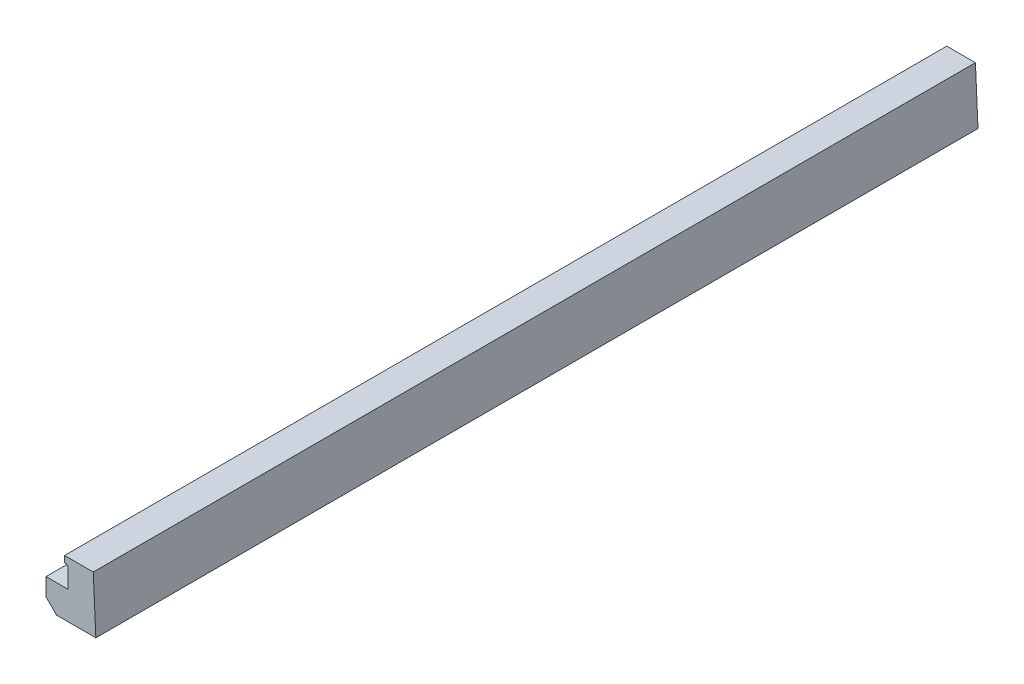
ISO-10303-21;
HEADER;
FILE_DESCRIPTION(('STEP AP214'),'2;1');
FILE_NAME('part.step','',(''),(''),'','','');
FILE_SCHEMA(('AUTOMOTIVE_DESIGN { 1 0 10303 214 1 1 1 1 }'));
ENDSEC;
DATA;
#1=APPLICATION_CONTEXT('core data for automotive mechanical design processes');
#2=APPLICATION_PROTOCOL_DEFINITION('international standard','automotive_design',2000,#1);
#3=PRODUCT_CONTEXT('',#1,'mechanical');
#4=PRODUCT('Part','Part','',(#3));
#5=PRODUCT_RELATED_PRODUCT_CATEGORY('part','',(#4));
#6=PRODUCT_DEFINITION_FORMATION('','',#4);
#7=PRODUCT_DEFINITION_CONTEXT('part definition',#1,'design');
#8=PRODUCT_DEFINITION('design','',#6,#7);
#9=PRODUCT_DEFINITION_SHAPE('','',#8);
#10=(LENGTH_UNIT() NAMED_UNIT(*) SI_UNIT(.MILLI.,.METRE.));
#11=(NAMED_UNIT(*) PLANE_ANGLE_UNIT() SI_UNIT($,.RADIAN.));
#12=(NAMED_UNIT(*) SI_UNIT($,.STERADIAN.) SOLID_ANGLE_UNIT());
#13=UNCERTAINTY_MEASURE_WITH_UNIT(LENGTH_MEASURE(1.E-05),#10,'distance_accuracy_value','');
#14=(GEOMETRIC_REPRESENTATION_CONTEXT(3) GLOBAL_UNCERTAINTY_ASSIGNED_CONTEXT((#13)) GLOBAL_UNIT_ASSIGNED_CONTEXT((#10,
#11,#12)) REPRESENTATION_CONTEXT('',''));
#15=CARTESIAN_POINT('',(0.,0.,0.));
#16=DIRECTION('',(0.,0.,1.));
#17=DIRECTION('',(1.,0.,0.));
#18=AXIS2_PLACEMENT_3D('',#15,#16,#17);
#19=CARTESIAN_POINT('',(19.49999999916,-19.50000000004,-47.));
#20=DIRECTION('',(0.,0.,-1.));
#21=DIRECTION('',(-1.,0.,0.));
#22=AXIS2_PLACEMENT_3D('',#19,#20,#21);
#23=PLANE('',#22);
#24=DIRECTION('',(0.0460603900408455,-0.998938657010171,0.));
#25=VECTOR('',#24,1.);
#26=CARTESIAN_POINT('',(0.845499997899992,22.60000000118,-47.));
#27=LINE('',#26,#25);
#28=CARTESIAN_POINT('',(0.845499997899992,22.60000000118,-47.));
#29=VERTEX_POINT('',#28);
#30=CARTESIAN_POINT('',(1.43224119488036,9.875,-47.));
#31=VERTEX_POINT('',#30);
#32=EDGE_CURVE('E292',#29,#31,#27,.T.);
#33=ORIENTED_EDGE('',*,*,#32,.T.);
#34=DIRECTION('',(1.,0.,0.));
#35=VECTOR('',#34,1.);
#36=CARTESIAN_POINT('',(-9.875,9.875,-47.));
#37=LINE('',#36,#35);
#38=CARTESIAN_POINT('',(-7.54154762208439,9.875,-47.));
#39=VERTEX_POINT('',#38);
#40=EDGE_CURVE('E248',#39,#31,#37,.T.);
#41=ORIENTED_EDGE('',*,*,#40,.F.);
#42=DIRECTION('',(0.707106781186548,-0.707106781186548,0.));
#43=VECTOR('',#42,1.);
#44=CARTESIAN_POINT('',(-9.95000000103665,12.2834523789523,-47.));
#45=LINE('',#44,#43);
#46=CARTESIAN_POINT('',(-9.95000000103665,12.2834523789523,-47.));
#47=VERTEX_POINT('',#46);
#48=EDGE_CURVE('E300',#47,#39,#45,.T.);
#49=ORIENTED_EDGE('',*,*,#48,.F.);
#50=DIRECTION('',(0.,1.,0.));
#51=VECTOR('',#50,1.);
#52=CARTESIAN_POINT('',(-9.94999999726113,16.5250000040714,-47.));
#53=LINE('',#52,#51);
#54=CARTESIAN_POINT('',(-9.94999999726113,16.30000000118,-47.));
#55=VERTEX_POINT('',#54);
#56=EDGE_CURVE('E308',#47,#55,#53,.T.);
#57=ORIENTED_EDGE('',*,*,#56,.T.);
#58=DIRECTION('',(-1.,0.,0.));
#59=VECTOR('',#58,1.);
#60=CARTESIAN_POINT('',(-4.89999999720113,16.30000000118,-47.));
#61=LINE('',#60,#59);
#62=CARTESIAN_POINT('',(-4.89999999720113,16.30000000118,-47.));
#63=VERTEX_POINT('',#62);
#64=EDGE_CURVE('E180',#63,#55,#61,.T.);
#65=ORIENTED_EDGE('',*,*,#64,.F.);
#66=DIRECTION('',(0.,1.,0.));
#67=VECTOR('',#66,1.);
#68=CARTESIAN_POINT('',(-4.89999999720113,20.5000000035114,-47.));
#69=LINE('',#68,#67);
#70=CARTESIAN_POINT('',(-4.89999999720113,20.5000000035114,-47.));
#71=VERTEX_POINT('',#70);
#72=EDGE_CURVE('E312',#63,#71,#69,.T.);
#73=ORIENTED_EDGE('',*,*,#72,.T.);
#74=CARTESIAN_POINT('',(-5.49999999720113,20.5000000035114,-47.));
#75=DIRECTION('',(0.,0.,1.));
#76=DIRECTION('',(1.,0.,0.));
#77=AXIS2_PLACEMENT_3D('',#74,#75,#76);
#78=CIRCLE('',#77,0.599999999999997);
#79=CARTESIAN_POINT('',(-5.49999999720113,21.1000000035114,-47.));
#80=VERTEX_POINT('',#79);
#81=EDGE_CURVE('E315',#71,#80,#78,.T.);
#82=ORIENTED_EDGE('',*,*,#81,.T.);
#83=CARTESIAN_POINT('',(-5.50000000210001,21.3000000035114,-47.));
#84=DIRECTION('',(0.,0.,-1.));
#85=DIRECTION('',(-1.,0.,0.));
#86=AXIS2_PLACEMENT_3D('',#83,#84,#85);
#87=CIRCLE('',#86,0.2);
#88=CARTESIAN_POINT('',(-5.70000000210001,21.3000000035114,-47.));
#89=VERTEX_POINT('',#88);
#90=EDGE_CURVE('E173',#80,#89,#87,.T.);
#91=ORIENTED_EDGE('',*,*,#90,.T.);
#92=DIRECTION('',(0.,1.,0.));
#93=VECTOR('',#92,1.);
#94=CARTESIAN_POINT('',(-5.70000000210001,22.00000000118,-47.));
#95=LINE('',#94,#93);
#96=CARTESIAN_POINT('',(-5.70000000210001,22.60000000118,-47.));
#97=VERTEX_POINT('',#96);
#98=EDGE_CURVE('E317',#89,#97,#95,.T.);
#99=ORIENTED_EDGE('',*,*,#98,.T.);
#100=DIRECTION('',(1.,0.,0.));
#101=VECTOR('',#100,1.);
#102=CARTESIAN_POINT('',(-5.70000000210001,22.60000000118,-47.));
#103=LINE('',#102,#101);
#104=EDGE_CURVE('E289',#97,#29,#103,.T.);
#105=ORIENTED_EDGE('',*,*,#104,.T.);
#106=EDGE_LOOP('',(#33,#41,#49,#57,#65,#73,#82,#91,#99,#105));
#107=FACE_BOUND('',#106,.T.);
#108=ADVANCED_FACE('F165',(#107),#23,.T.);
#109=CARTESIAN_POINT('',(-9.94999999726113,16.5250000040714,-47.));
#110=DIRECTION('',(1.,0.,0.));
#111=DIRECTION('',(0.,1.,0.));
#112=AXIS2_PLACEMENT_3D('',#109,#110,#111);
#113=PLANE('',#112);
#114=DIRECTION('',(0.,0.,1.));
#115=VECTOR('',#114,1.);
#116=CARTESIAN_POINT('',(-9.95000000103665,12.2834523789523,-47.));
#117=LINE('',#116,#115);
#118=CARTESIAN_POINT('',(-9.95000000103665,12.2834523789523,154.45));
#119=VERTEX_POINT('',#118);
#120=EDGE_CURVE('E298',#47,#119,#117,.T.);
#121=ORIENTED_EDGE('',*,*,#120,.T.);
#122=DIRECTION('',(-9.39991733488001E-10,-1.,0.));
#123=VECTOR('',#122,1.);
#124=CARTESIAN_POINT('',(-9.94999999726113,16.30000000118,154.45));
#125=LINE('',#124,#123);
#126=CARTESIAN_POINT('',(-9.94999999726113,16.30000000118,154.45));
#127=VERTEX_POINT('',#126);
#128=EDGE_CURVE('E286',#127,#119,#125,.T.);
#129=ORIENTED_EDGE('',*,*,#128,.F.);
#130=DIRECTION('',(0.,0.,1.));
#131=VECTOR('',#130,1.);
#132=CARTESIAN_POINT('',(-9.94999999726113,16.30000000118,-47.));
#133=LINE('',#132,#131);
#134=EDGE_CURVE('E305',#55,#127,#133,.T.);
#135=ORIENTED_EDGE('',*,*,#134,.F.);
#136=ORIENTED_EDGE('',*,*,#56,.F.);
#137=EDGE_LOOP('',(#121,#129,#135,#136));
#138=FACE_BOUND('',#137,.T.);
#139=ADVANCED_FACE('F335',(#138),#113,.F.);
#140=CARTESIAN_POINT('',(-5.70000000210001,22.00000000118,-47.));
#141=DIRECTION('',(1.,0.,0.));
#142=DIRECTION('',(0.,0.,-1.));
#143=AXIS2_PLACEMENT_3D('',#140,#141,#142);
#144=PLANE('',#143);
#145=ORIENTED_EDGE('',*,*,#98,.F.);
#146=DIRECTION('',(0.,0.,1.));
#147=VECTOR('',#146,1.);
#148=CARTESIAN_POINT('',(-5.70000000210001,21.3000000035114,-47.));
#149=LINE('',#148,#147);
#150=CARTESIAN_POINT('',(-5.70000000210001,21.3000000035114,154.45));
#151=VERTEX_POINT('',#150);
#152=EDGE_CURVE('E12',#89,#151,#149,.T.);
#153=ORIENTED_EDGE('',*,*,#152,.T.);
#154=DIRECTION('',(0.,-1.,0.));
#155=VECTOR('',#154,1.);
#156=CARTESIAN_POINT('',(-5.70000000210001,22.60000000118,154.45));
#157=LINE('',#156,#155);
#158=CARTESIAN_POINT('',(-5.70000000210001,22.60000000118,154.45));
#159=VERTEX_POINT('',#158);
#160=EDGE_CURVE('E271',#159,#151,#157,.T.);
#161=ORIENTED_EDGE('',*,*,#160,.F.);
#162=DIRECTION('',(0.,0.,1.));
#163=VECTOR('',#162,1.);
#164=CARTESIAN_POINT('',(-5.70000000210001,22.60000000118,-47.));
#165=LINE('',#164,#163);
#166=EDGE_CURVE('E293',#97,#159,#165,.T.);
#167=ORIENTED_EDGE('',*,*,#166,.F.);
#168=EDGE_LOOP('',(#145,#153,#161,#167));
#169=FACE_BOUND('',#168,.T.);
#170=ADVANCED_FACE('F345',(#169),#144,.F.);
#171=CARTESIAN_POINT('',(-5.49999999720113,20.5000000035114,-47.));
#172=DIRECTION('',(0.,0.,1.));
#173=DIRECTION('',(1.,0.,0.));
#174=AXIS2_PLACEMENT_3D('',#171,#172,#173);
#175=CYLINDRICAL_SURFACE('',#174,0.599999999999997);
#176=DIRECTION('',(0.,0.,1.));
#177=VECTOR('',#176,1.);
#178=CARTESIAN_POINT('',(-4.89999999720113,20.5000000035114,-47.));
#179=LINE('',#178,#177);
#180=CARTESIAN_POINT('',(-4.89999999720113,20.5000000035114,154.45));
#181=VERTEX_POINT('',#180);
#182=EDGE_CURVE('E319',#71,#181,#179,.T.);
#183=ORIENTED_EDGE('',*,*,#182,.T.);
#184=CARTESIAN_POINT('',(-5.49999999720113,20.5000000035114,154.45));
#185=DIRECTION('',(0.,0.,-1.));
#186=DIRECTION('',(1.,0.,0.));
#187=AXIS2_PLACEMENT_3D('',#184,#185,#186);
#188=CIRCLE('',#187,0.599999999999996);
#189=CARTESIAN_POINT('',(-5.49999999720113,21.1000000035114,154.45));
#190=VERTEX_POINT('',#189);
#191=EDGE_CURVE('E277',#190,#181,#188,.T.);
#192=ORIENTED_EDGE('',*,*,#191,.F.);
#193=DIRECTION('',(0.,0.,1.));
#194=VECTOR('',#193,1.);
#195=CARTESIAN_POINT('',(-5.49999999720113,21.1000000035114,-47.));
#196=LINE('',#195,#194);
#197=EDGE_CURVE('E320',#80,#190,#196,.T.);
#198=ORIENTED_EDGE('',*,*,#197,.F.);
#199=ORIENTED_EDGE('',*,*,#81,.F.);
#200=EDGE_LOOP('',(#183,#192,#198,#199));
#201=FACE_BOUND('',#200,.T.);
#202=ADVANCED_FACE('F325',(#201),#175,.F.);
#203=CARTESIAN_POINT('',(-4.89999999720113,20.5000000035114,-47.));
#204=DIRECTION('',(1.,0.,0.));
#205=DIRECTION('',(0.,1.,0.));
#206=AXIS2_PLACEMENT_3D('',#203,#204,#205);
#207=PLANE('',#206);
#208=DIRECTION('',(0.,0.,1.));
#209=VECTOR('',#208,1.);
#210=CARTESIAN_POINT('',(-4.89999999720113,16.30000000118,-47.));
#211=LINE('',#210,#209);
#212=CARTESIAN_POINT('',(-4.89999999720113,16.30000000118,154.45));
#213=VERTEX_POINT('',#212);
#214=EDGE_CURVE('E306',#63,#213,#211,.T.);
#215=ORIENTED_EDGE('',*,*,#214,.T.);
#216=DIRECTION('',(0.,-1.,0.));
#217=VECTOR('',#216,1.);
#218=CARTESIAN_POINT('',(-4.89999999720113,20.5000000035114,154.45));
#219=LINE('',#218,#217);
#220=EDGE_CURVE('E280',#181,#213,#219,.T.);
#221=ORIENTED_EDGE('',*,*,#220,.F.);
#222=ORIENTED_EDGE('',*,*,#182,.F.);
#223=ORIENTED_EDGE('',*,*,#72,.F.);
#224=EDGE_LOOP('',(#215,#221,#222,#223));
#225=FACE_BOUND('',#224,.T.);
#226=ADVANCED_FACE('F330',(#225),#207,.F.);
#227=CARTESIAN_POINT('',(-5.50000000210001,21.3000000035114,-47.));
#228=DIRECTION('',(0.,0.,1.));
#229=DIRECTION('',(1.,0.,0.));
#230=AXIS2_PLACEMENT_3D('',#227,#228,#229);
#231=CYLINDRICAL_SURFACE('',#230,0.2);
#232=ORIENTED_EDGE('',*,*,#90,.F.);
#233=ORIENTED_EDGE('',*,*,#197,.T.);
#234=CARTESIAN_POINT('',(-5.50000000210001,21.3000000035114,154.45));
#235=DIRECTION('',(0.,0.,1.));
#236=DIRECTION('',(1.,0.,0.));
#237=AXIS2_PLACEMENT_3D('',#234,#235,#236);
#238=CIRCLE('',#237,0.199999999999999);
#239=EDGE_CURVE('E274',#151,#190,#238,.T.);
#240=ORIENTED_EDGE('',*,*,#239,.F.);
#241=ORIENTED_EDGE('',*,*,#152,.F.);
#242=EDGE_LOOP('',(#232,#233,#240,#241));
#243=FACE_BOUND('',#242,.T.);
#244=ADVANCED_FACE('F167',(#243),#231,.T.);
#245=CARTESIAN_POINT('',(-9.875,9.875,-47.));
#246=DIRECTION('',(0.,-1.,0.));
#247=DIRECTION('',(0.,0.,-1.));
#248=AXIS2_PLACEMENT_3D('',#245,#246,#247);
#249=PLANE('',#248);
#250=DIRECTION('',(0.,0.,1.));
#251=VECTOR('',#250,1.);
#252=CARTESIAN_POINT('',(1.43224119488036,9.875,-47.));
#253=LINE('',#252,#251);
#254=CARTESIAN_POINT('',(1.43224119488036,9.875,154.45));
#255=VERTEX_POINT('',#254);
#256=EDGE_CURVE('E242',#31,#255,#253,.T.);
#257=ORIENTED_EDGE('',*,*,#256,.T.);
#258=DIRECTION('',(1.,0.,0.));
#259=VECTOR('',#258,1.);
#260=CARTESIAN_POINT('',(-7.54154762208439,9.875,154.45));
#261=LINE('',#260,#259);
#262=CARTESIAN_POINT('',(-7.54154762208439,9.875,154.45));
#263=VERTEX_POINT('',#262);
#264=EDGE_CURVE('E246',#263,#255,#261,.T.);
#265=ORIENTED_EDGE('',*,*,#264,.F.);
#266=DIRECTION('',(0.,0.,-1.));
#267=VECTOR('',#266,1.);
#268=CARTESIAN_POINT('',(-7.54154762208439,9.875,-47.));
#269=LINE('',#268,#267);
#270=EDGE_CURVE('E252',#263,#39,#269,.T.);
#271=ORIENTED_EDGE('',*,*,#270,.T.);
#272=ORIENTED_EDGE('',*,*,#40,.T.);
#273=EDGE_LOOP('',(#257,#265,#271,#272));
#274=FACE_BOUND('',#273,.T.);
#275=ADVANCED_FACE('F244',(#274),#249,.T.);
#276=CARTESIAN_POINT('',(-9.95000000103665,12.2834523789523,-47.));
#277=DIRECTION('',(-0.707106781186547,-0.707106781186547,0.));
#278=DIRECTION('',(0.707106781186548,-0.707106781186548,0.));
#279=AXIS2_PLACEMENT_3D('',#276,#277,#278);
#280=PLANE('',#279);
#281=ORIENTED_EDGE('',*,*,#270,.F.);
#282=DIRECTION('',(0.707106781186547,-0.707106781186547,0.));
#283=VECTOR('',#282,1.);
#284=CARTESIAN_POINT('',(-9.95000000103665,12.2834523789523,154.45));
#285=LINE('',#284,#283);
#286=EDGE_CURVE('E267',#119,#263,#285,.T.);
#287=ORIENTED_EDGE('',*,*,#286,.F.);
#288=ORIENTED_EDGE('',*,*,#120,.F.);
#289=ORIENTED_EDGE('',*,*,#48,.T.);
#290=EDGE_LOOP('',(#281,#287,#288,#289));
#291=FACE_BOUND('',#290,.T.);
#292=ADVANCED_FACE('F338',(#291),#280,.T.);
#293=CARTESIAN_POINT('',(-4.89999999720113,16.30000000118,-47.));
#294=DIRECTION('',(0.,1.,0.));
#295=DIRECTION('',(0.,0.,1.));
#296=AXIS2_PLACEMENT_3D('',#293,#294,#295);
#297=PLANE('',#296);
#298=ORIENTED_EDGE('',*,*,#134,.T.);
#299=DIRECTION('',(-1.,0.,0.));
#300=VECTOR('',#299,1.);
#301=CARTESIAN_POINT('',(-4.89999999720113,16.30000000118,154.45));
#302=LINE('',#301,#300);
#303=EDGE_CURVE('E283',#213,#127,#302,.T.);
#304=ORIENTED_EDGE('',*,*,#303,.F.);
#305=ORIENTED_EDGE('',*,*,#214,.F.);
#306=ORIENTED_EDGE('',*,*,#64,.T.);
#307=EDGE_LOOP('',(#298,#304,#305,#306));
#308=FACE_BOUND('',#307,.T.);
#309=ADVANCED_FACE('F331',(#308),#297,.T.);
#310=CARTESIAN_POINT('',(0.845499997899992,22.60000000118,-47.));
#311=DIRECTION('',(-0.998938657010172,-0.0460603900408455,0.));
#312=DIRECTION('',(0.0460603900408455,-0.998938657010172,0.));
#313=AXIS2_PLACEMENT_3D('',#310,#311,#312);
#314=PLANE('',#313);
#315=DIRECTION('',(0.,0.,1.));
#316=VECTOR('',#315,1.);
#317=CARTESIAN_POINT('',(0.845499997899992,22.60000000118,-47.));
#318=LINE('',#317,#316);
#319=CARTESIAN_POINT('',(0.845499997899992,22.60000000118,154.45));
#320=VERTEX_POINT('',#319);
#321=EDGE_CURVE('E253',#29,#320,#318,.T.);
#322=ORIENTED_EDGE('',*,*,#321,.T.);
#323=DIRECTION('',(-0.0460603900408455,0.998938657010171,0.));
#324=VECTOR('',#323,1.);
#325=CARTESIAN_POINT('',(1.43224119488036,9.875,154.45));
#326=LINE('',#325,#324);
#327=EDGE_CURVE('E256',#255,#320,#326,.T.);
#328=ORIENTED_EDGE('',*,*,#327,.F.);
#329=ORIENTED_EDGE('',*,*,#256,.F.);
#330=ORIENTED_EDGE('',*,*,#32,.F.);
#331=EDGE_LOOP('',(#322,#328,#329,#330));
#332=FACE_BOUND('',#331,.T.);
#333=ADVANCED_FACE('F257',(#332),#314,.F.);
#334=CARTESIAN_POINT('',(-5.70000000210001,22.60000000118,-47.));
#335=DIRECTION('',(0.,-1.,0.));
#336=DIRECTION('',(0.,0.,-1.));
#337=AXIS2_PLACEMENT_3D('',#334,#335,#336);
#338=PLANE('',#337);
#339=ORIENTED_EDGE('',*,*,#166,.T.);
#340=DIRECTION('',(-1.,0.,0.));
#341=VECTOR('',#340,1.);
#342=CARTESIAN_POINT('',(0.845499997899992,22.60000000118,154.45));
#343=LINE('',#342,#341);
#344=EDGE_CURVE('E261',#320,#159,#343,.T.);
#345=ORIENTED_EDGE('',*,*,#344,.F.);
#346=ORIENTED_EDGE('',*,*,#321,.F.);
#347=ORIENTED_EDGE('',*,*,#104,.F.);
#348=EDGE_LOOP('',(#339,#345,#346,#347));
#349=FACE_BOUND('',#348,.T.);
#350=ADVANCED_FACE('F342',(#349),#338,.F.);
#351=CARTESIAN_POINT('',(-5.50000000210001,21.3000000035114,154.45));
#352=DIRECTION('',(0.,0.,1.));
#353=DIRECTION('',(1.,0.,0.));
#354=AXIS2_PLACEMENT_3D('',#351,#352,#353);
#355=PLANE('',#354);
#356=ORIENTED_EDGE('',*,*,#264,.T.);
#357=ORIENTED_EDGE('',*,*,#327,.T.);
#358=ORIENTED_EDGE('',*,*,#344,.T.);
#359=ORIENTED_EDGE('',*,*,#160,.T.);
#360=ORIENTED_EDGE('',*,*,#239,.T.);
#361=ORIENTED_EDGE('',*,*,#191,.T.);
#362=ORIENTED_EDGE('',*,*,#220,.T.);
#363=ORIENTED_EDGE('',*,*,#303,.T.);
#364=ORIENTED_EDGE('',*,*,#128,.T.);
#365=ORIENTED_EDGE('',*,*,#286,.T.);
#366=EDGE_LOOP('',(#356,#357,#358,#359,#360,#361,#362,#363,#364,#365));
#367=FACE_BOUND('',#366,.T.);
#368=ADVANCED_FACE('F264',(#367),#355,.T.);
#369=CLOSED_SHELL('',(#108,#139,#170,#202,#226,#244,#275,#292,#309,#333,#350,#368));
#370=MANIFOLD_SOLID_BREP('B2',#369);
#371=ADVANCED_BREP_SHAPE_REPRESENTATION('',(#18,#370),#14);
#372=SHAPE_DEFINITION_REPRESENTATION(#9,#371);
ENDSEC;
END-ISO-10303-21;
